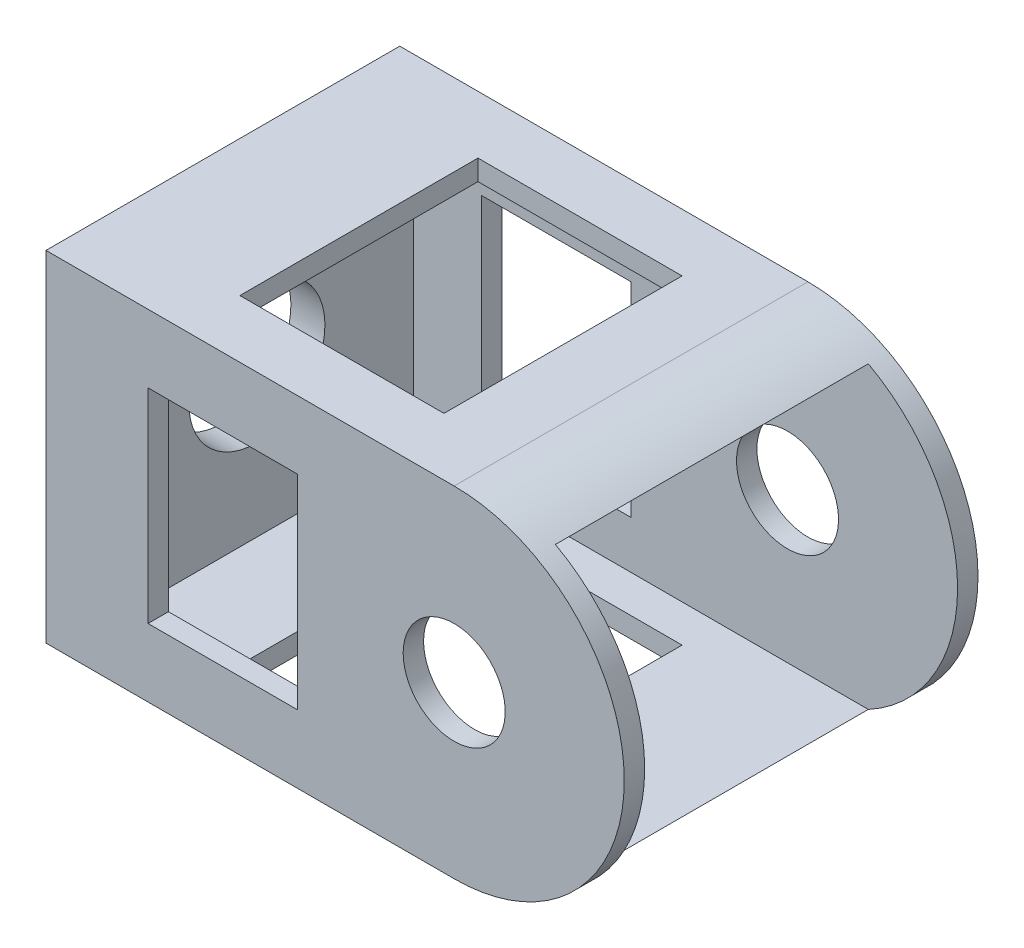
ISO-10303-21;
HEADER;
FILE_DESCRIPTION(('STEP AP214'),'2;1');
FILE_NAME('part.step','',(''),(''),'','','');
FILE_SCHEMA(('AUTOMOTIVE_DESIGN { 1 0 10303 214 1 1 1 1 }'));
ENDSEC;
DATA;
#1=APPLICATION_CONTEXT('core data for automotive mechanical design processes');
#2=APPLICATION_PROTOCOL_DEFINITION('international standard','automotive_design',2000,#1);
#3=PRODUCT_CONTEXT('',#1,'mechanical');
#4=PRODUCT('Part','Part','',(#3));
#5=PRODUCT_RELATED_PRODUCT_CATEGORY('part','',(#4));
#6=PRODUCT_DEFINITION_FORMATION('','',#4);
#7=PRODUCT_DEFINITION_CONTEXT('part definition',#1,'design');
#8=PRODUCT_DEFINITION('design','',#6,#7);
#9=PRODUCT_DEFINITION_SHAPE('','',#8);
#10=(LENGTH_UNIT() NAMED_UNIT(*) SI_UNIT(.MILLI.,.METRE.));
#11=(NAMED_UNIT(*) PLANE_ANGLE_UNIT() SI_UNIT($,.RADIAN.));
#12=(NAMED_UNIT(*) SI_UNIT($,.STERADIAN.) SOLID_ANGLE_UNIT());
#13=UNCERTAINTY_MEASURE_WITH_UNIT(LENGTH_MEASURE(1.E-05),#10,'distance_accuracy_value','');
#14=(GEOMETRIC_REPRESENTATION_CONTEXT(3) GLOBAL_UNCERTAINTY_ASSIGNED_CONTEXT((#13)) GLOBAL_UNIT_ASSIGNED_CONTEXT((#10,
#11,#12)) REPRESENTATION_CONTEXT('',''));
#15=CARTESIAN_POINT('',(0.,0.,0.));
#16=DIRECTION('',(0.,0.,1.));
#17=DIRECTION('',(1.,0.,0.));
#18=AXIS2_PLACEMENT_3D('',#15,#16,#17);
#19=CARTESIAN_POINT('',(55.,-25.,52.));
#20=DIRECTION('',(0.,0.,-1.));
#21=DIRECTION('',(-1.,0.,0.));
#22=AXIS2_PLACEMENT_3D('',#19,#20,#21);
#23=CYLINDRICAL_SURFACE('',#22,7.5);
#24=CARTESIAN_POINT('',(55.,-25.,49.));
#25=DIRECTION('',(0.,0.,1.));
#26=DIRECTION('',(1.,0.,0.));
#27=AXIS2_PLACEMENT_3D('',#24,#25,#26);
#28=CIRCLE('',#27,7.5);
#29=CARTESIAN_POINT('',(47.5,-25.,49.));
#30=VERTEX_POINT('',#29);
#31=EDGE_CURVE('E293',#30,#30,#28,.T.);
#32=CARTESIAN_POINT('',(55.,-25.,52.));
#33=DIRECTION('',(0.,0.,1.));
#34=DIRECTION('',(1.,0.,0.));
#35=AXIS2_PLACEMENT_3D('',#32,#33,#34);
#36=CIRCLE('',#35,7.5);
#37=CARTESIAN_POINT('',(47.5,-25.,52.));
#38=VERTEX_POINT('',#37);
#39=EDGE_CURVE('E209',#38,#38,#36,.T.);
#40=CARTESIAN_POINT('',(47.5,-25.,49.));
#41=CARTESIAN_POINT('',(47.5,-25.,49.03125));
#42=CARTESIAN_POINT('',(47.5,-25.,49.0625));
#43=CARTESIAN_POINT('',(47.5,-25.,49.125));
#44=CARTESIAN_POINT('',(47.5,-25.,49.15625));
#45=CARTESIAN_POINT('',(47.5,-25.,49.21875));
#46=CARTESIAN_POINT('',(47.5,-25.,49.25));
#47=CARTESIAN_POINT('',(47.5,-25.,49.3125));
#48=CARTESIAN_POINT('',(47.5,-25.,49.34375));
#49=CARTESIAN_POINT('',(47.5,-25.,49.40625));
#50=CARTESIAN_POINT('',(47.5,-25.,49.4375));
#51=CARTESIAN_POINT('',(47.5,-25.,49.5));
#52=CARTESIAN_POINT('',(47.5,-25.,49.53125));
#53=CARTESIAN_POINT('',(47.5,-25.,49.59375));
#54=CARTESIAN_POINT('',(47.5,-25.,49.625));
#55=CARTESIAN_POINT('',(47.5,-25.,49.6875));
#56=CARTESIAN_POINT('',(47.5,-25.,49.71875));
#57=CARTESIAN_POINT('',(47.5,-25.,49.78125));
#58=CARTESIAN_POINT('',(47.5,-25.,49.8125));
#59=CARTESIAN_POINT('',(47.5,-25.,49.875));
#60=CARTESIAN_POINT('',(47.5,-25.,49.90625));
#61=CARTESIAN_POINT('',(47.5,-25.,49.96875));
#62=CARTESIAN_POINT('',(47.5,-25.,50.));
#63=CARTESIAN_POINT('',(47.5,-25.,50.0625));
#64=CARTESIAN_POINT('',(47.5,-25.,50.09375));
#65=CARTESIAN_POINT('',(47.5,-25.,50.15625));
#66=CARTESIAN_POINT('',(47.5,-25.,50.1875));
#67=CARTESIAN_POINT('',(47.5,-25.,50.25));
#68=CARTESIAN_POINT('',(47.5,-25.,50.28125));
#69=CARTESIAN_POINT('',(47.5,-25.,50.34375));
#70=CARTESIAN_POINT('',(47.5,-25.,50.375));
#71=CARTESIAN_POINT('',(47.5,-25.,50.4375));
#72=CARTESIAN_POINT('',(47.5,-25.,50.46875));
#73=CARTESIAN_POINT('',(47.5,-25.,50.53125));
#74=CARTESIAN_POINT('',(47.5,-25.,50.5625));
#75=CARTESIAN_POINT('',(47.5,-25.,50.625));
#76=CARTESIAN_POINT('',(47.5,-25.,50.65625));
#77=CARTESIAN_POINT('',(47.5,-25.,50.71875));
#78=CARTESIAN_POINT('',(47.5,-25.,50.75));
#79=CARTESIAN_POINT('',(47.5,-25.,50.8125));
#80=CARTESIAN_POINT('',(47.5,-25.,50.84375));
#81=CARTESIAN_POINT('',(47.5,-25.,50.90625));
#82=CARTESIAN_POINT('',(47.5,-25.,50.9375));
#83=CARTESIAN_POINT('',(47.5,-25.,51.));
#84=CARTESIAN_POINT('',(47.5,-25.,51.03125));
#85=CARTESIAN_POINT('',(47.5,-25.,51.09375));
#86=CARTESIAN_POINT('',(47.5,-25.,51.125));
#87=CARTESIAN_POINT('',(47.5,-25.,51.1875));
#88=CARTESIAN_POINT('',(47.5,-25.,51.21875));
#89=CARTESIAN_POINT('',(47.5,-25.,51.28125));
#90=CARTESIAN_POINT('',(47.5,-25.,51.3125));
#91=CARTESIAN_POINT('',(47.5,-25.,51.375));
#92=CARTESIAN_POINT('',(47.5,-25.,51.40625));
#93=CARTESIAN_POINT('',(47.5,-25.,51.46875));
#94=CARTESIAN_POINT('',(47.5,-25.,51.5));
#95=CARTESIAN_POINT('',(47.5,-25.,51.5625));
#96=CARTESIAN_POINT('',(47.5,-25.,51.59375));
#97=CARTESIAN_POINT('',(47.5,-25.,51.65625));
#98=CARTESIAN_POINT('',(47.5,-25.,51.6875));
#99=CARTESIAN_POINT('',(47.5,-25.,51.75));
#100=CARTESIAN_POINT('',(47.5,-25.,51.78125));
#101=CARTESIAN_POINT('',(47.5,-25.,51.84375));
#102=CARTESIAN_POINT('',(47.5,-25.,51.875));
#103=CARTESIAN_POINT('',(47.5,-25.,51.9375));
#104=CARTESIAN_POINT('',(47.5,-25.,51.96875));
#105=CARTESIAN_POINT('',(47.5,-25.,52.));
#106=B_SPLINE_CURVE_WITH_KNOTS('',3,(#40,#41,#42,#43,#44,#45,#46,#47,#48,#49,#50,#51,#52,#53,
#54,#55,#56,#57,#58,#59,#60,#61,#62,#63,#64,#65,#66,#67,#68,#69,#70,#71,#72,#73,#74,#75,#76,#77,
#78,#79,#80,#81,#82,#83,#84,#85,#86,#87,#88,#89,#90,#91,#92,#93,#94,#95,#96,#97,#98,#99,#100,
#101,#102,#103,#104,#105),.UNSPECIFIED.,.F.,.F.,(4,2,2,2,2,2,2,2,2,2,2,2,2,2,2,2,2,2,2,2,2,2,2,
2,2,2,2,2,2,2,2,2,4),(0.,0.0937499999999966,0.1875,0.281249999999997,0.375,0.468749999999997,
0.5625,0.656249999999997,0.750000000000001,0.843749999999997,0.937500000000001,1.03125,1.125,
1.21875,1.3125,1.40625,1.5,1.59375,1.6875,1.78125,1.875,1.96875,2.0625,2.15625,2.25,2.34375,
2.4375,2.53125,2.625,2.71875,2.8125,2.90625,3.),.UNSPECIFIED.);
#107=EDGE_CURVE('BSEAM37',#30,#38,#106,.T.);
#108=ORIENTED_EDGE('',*,*,#31,.F.);
#109=ORIENTED_EDGE('',*,*,#39,.T.);
#110=ORIENTED_EDGE('',*,*,#107,.T.);
#111=ORIENTED_EDGE('',*,*,#107,.F.);
#112=EDGE_LOOP('',(#108,#110,#109,#111));
#113=FACE_BOUND('',#112,.T.);
#114=ADVANCED_FACE('F37',(#113),#23,.F.);
#115=CARTESIAN_POINT('',(10.,-10.,52.));
#116=DIRECTION('',(1.,0.,0.));
#117=DIRECTION('',(0.,0.,-1.));
#118=AXIS2_PLACEMENT_3D('',#115,#116,#117);
#119=PLANE('',#118);
#120=DIRECTION('',(0.,-1.,0.));
#121=VECTOR('',#120,1.);
#122=CARTESIAN_POINT('',(10.,-10.,49.));
#123=LINE('',#122,#121);
#124=CARTESIAN_POINT('',(10.,-10.,49.));
#125=VERTEX_POINT('',#124);
#126=CARTESIAN_POINT('',(10.,-40.,49.));
#127=VERTEX_POINT('',#126);
#128=EDGE_CURVE('E291',#125,#127,#123,.T.);
#129=ORIENTED_EDGE('',*,*,#128,.F.);
#130=DIRECTION('',(0.,0.,-1.));
#131=VECTOR('',#130,1.);
#132=CARTESIAN_POINT('',(10.,-10.,52.));
#133=LINE('',#132,#131);
#134=CARTESIAN_POINT('',(10.,-10.,52.));
#135=VERTEX_POINT('',#134);
#136=EDGE_CURVE('E360',#135,#125,#133,.T.);
#137=ORIENTED_EDGE('',*,*,#136,.F.);
#138=DIRECTION('',(0.,-1.,0.));
#139=VECTOR('',#138,1.);
#140=CARTESIAN_POINT('',(10.,-10.,52.));
#141=LINE('',#140,#139);
#142=CARTESIAN_POINT('',(10.,-40.,52.));
#143=VERTEX_POINT('',#142);
#144=EDGE_CURVE('E339',#135,#143,#141,.T.);
#145=ORIENTED_EDGE('',*,*,#144,.T.);
#146=DIRECTION('',(0.,0.,-1.));
#147=VECTOR('',#146,1.);
#148=CARTESIAN_POINT('',(10.,-40.,52.));
#149=LINE('',#148,#147);
#150=EDGE_CURVE('E372',#143,#127,#149,.T.);
#151=ORIENTED_EDGE('',*,*,#150,.T.);
#152=EDGE_LOOP('',(#129,#137,#145,#151));
#153=FACE_BOUND('',#152,.T.);
#154=ADVANCED_FACE('F421',(#153),#119,.T.);
#155=CARTESIAN_POINT('',(10.,-40.,52.));
#156=DIRECTION('',(0.,1.,0.));
#157=DIRECTION('',(0.,0.,1.));
#158=AXIS2_PLACEMENT_3D('',#155,#156,#157);
#159=PLANE('',#158);
#160=DIRECTION('',(1.,0.,0.));
#161=VECTOR('',#160,1.);
#162=CARTESIAN_POINT('',(10.,-40.,49.));
#163=LINE('',#162,#161);
#164=CARTESIAN_POINT('',(32.,-40.,49.));
#165=VERTEX_POINT('',#164);
#166=EDGE_CURVE('E289',#127,#165,#163,.T.);
#167=ORIENTED_EDGE('',*,*,#166,.F.);
#168=ORIENTED_EDGE('',*,*,#150,.F.);
#169=DIRECTION('',(1.,0.,0.));
#170=VECTOR('',#169,1.);
#171=CARTESIAN_POINT('',(10.,-40.,52.));
#172=LINE('',#171,#170);
#173=CARTESIAN_POINT('',(32.,-40.,52.));
#174=VERTEX_POINT('',#173);
#175=EDGE_CURVE('E341',#143,#174,#172,.T.);
#176=ORIENTED_EDGE('',*,*,#175,.T.);
#177=DIRECTION('',(0.,0.,-1.));
#178=VECTOR('',#177,1.);
#179=CARTESIAN_POINT('',(32.,-40.,52.));
#180=LINE('',#179,#178);
#181=EDGE_CURVE('E368',#174,#165,#180,.T.);
#182=ORIENTED_EDGE('',*,*,#181,.T.);
#183=EDGE_LOOP('',(#167,#168,#176,#182));
#184=FACE_BOUND('',#183,.T.);
#185=ADVANCED_FACE('F428',(#184),#159,.T.);
#186=CARTESIAN_POINT('',(10.,-10.,52.));
#187=DIRECTION('',(0.,-1.,0.));
#188=DIRECTION('',(0.,0.,-1.));
#189=AXIS2_PLACEMENT_3D('',#186,#187,#188);
#190=PLANE('',#189);
#191=DIRECTION('',(-1.,0.,0.));
#192=VECTOR('',#191,1.);
#193=CARTESIAN_POINT('',(10.,-10.,49.));
#194=LINE('',#193,#192);
#195=CARTESIAN_POINT('',(32.,-10.,49.));
#196=VERTEX_POINT('',#195);
#197=EDGE_CURVE('E11',#196,#125,#194,.T.);
#198=ORIENTED_EDGE('',*,*,#197,.F.);
#199=DIRECTION('',(0.,0.,-1.));
#200=VECTOR('',#199,1.);
#201=CARTESIAN_POINT('',(32.,-10.,52.));
#202=LINE('',#201,#200);
#203=CARTESIAN_POINT('',(32.,-10.,52.));
#204=VERTEX_POINT('',#203);
#205=EDGE_CURVE('E364',#204,#196,#202,.T.);
#206=ORIENTED_EDGE('',*,*,#205,.F.);
#207=DIRECTION('',(-1.,0.,0.));
#208=VECTOR('',#207,1.);
#209=CARTESIAN_POINT('',(10.,-10.,52.));
#210=LINE('',#209,#208);
#211=EDGE_CURVE('E347',#204,#135,#210,.T.);
#212=ORIENTED_EDGE('',*,*,#211,.T.);
#213=ORIENTED_EDGE('',*,*,#136,.T.);
#214=EDGE_LOOP('',(#198,#206,#212,#213));
#215=FACE_BOUND('',#214,.T.);
#216=ADVANCED_FACE('F481',(#215),#190,.T.);
#217=CARTESIAN_POINT('',(15.,-50.,8.5));
#218=DIRECTION('',(0.,0.,-1.));
#219=DIRECTION('',(-1.,0.,0.));
#220=AXIS2_PLACEMENT_3D('',#217,#218,#219);
#221=PLANE('',#220);
#222=DIRECTION('',(0.,1.,0.));
#223=VECTOR('',#222,1.);
#224=CARTESIAN_POINT('',(15.,-50.,8.5));
#225=LINE('',#224,#223);
#226=CARTESIAN_POINT('',(15.,-3.,8.5));
#227=VERTEX_POINT('',#226);
#228=CARTESIAN_POINT('',(15.,0.,8.5));
#229=VERTEX_POINT('',#228);
#230=EDGE_CURVE('E327',#227,#229,#225,.T.);
#231=ORIENTED_EDGE('',*,*,#230,.F.);
#232=DIRECTION('',(1.,0.,0.));
#233=VECTOR('',#232,1.);
#234=CARTESIAN_POINT('',(15.,-3.,8.5));
#235=LINE('',#234,#233);
#236=CARTESIAN_POINT('',(45.,-3.,8.5));
#237=VERTEX_POINT('',#236);
#238=EDGE_CURVE('E270',#227,#237,#235,.T.);
#239=ORIENTED_EDGE('',*,*,#238,.T.);
#240=DIRECTION('',(0.,1.,0.));
#241=VECTOR('',#240,1.);
#242=CARTESIAN_POINT('',(45.,-50.,8.5));
#243=LINE('',#242,#241);
#244=CARTESIAN_POINT('',(45.,0.,8.5));
#245=VERTEX_POINT('',#244);
#246=EDGE_CURVE('E331',#237,#245,#243,.T.);
#247=ORIENTED_EDGE('',*,*,#246,.T.);
#248=DIRECTION('',(-1.,0.,0.));
#249=VECTOR('',#248,1.);
#250=CARTESIAN_POINT('',(15.,0.,8.5));
#251=LINE('',#250,#249);
#252=EDGE_CURVE('E303',#245,#229,#251,.T.);
#253=ORIENTED_EDGE('',*,*,#252,.T.);
#254=EDGE_LOOP('',(#231,#239,#247,#253));
#255=FACE_BOUND('',#254,.T.);
#256=ADVANCED_FACE('F484',(#255),#221,.F.);
#257=CARTESIAN_POINT('',(45.,-50.,8.5));
#258=DIRECTION('',(1.,0.,0.));
#259=DIRECTION('',(0.,0.,-1.));
#260=AXIS2_PLACEMENT_3D('',#257,#258,#259);
#261=PLANE('',#260);
#262=ORIENTED_EDGE('',*,*,#246,.F.);
#263=DIRECTION('',(0.,0.,1.));
#264=VECTOR('',#263,1.);
#265=CARTESIAN_POINT('',(45.,-3.,8.5));
#266=LINE('',#265,#264);
#267=CARTESIAN_POINT('',(45.,-2.99999999999999,43.5));
#268=VERTEX_POINT('',#267);
#269=EDGE_CURVE('E267',#237,#268,#266,.T.);
#270=ORIENTED_EDGE('',*,*,#269,.T.);
#271=DIRECTION('',(0.,1.,0.));
#272=VECTOR('',#271,1.);
#273=CARTESIAN_POINT('',(45.,-50.,43.5));
#274=LINE('',#273,#272);
#275=CARTESIAN_POINT('',(45.,0.,43.5));
#276=VERTEX_POINT('',#275);
#277=EDGE_CURVE('E335',#268,#276,#274,.T.);
#278=ORIENTED_EDGE('',*,*,#277,.T.);
#279=DIRECTION('',(0.,0.,-1.));
#280=VECTOR('',#279,1.);
#281=CARTESIAN_POINT('',(45.,0.,8.5));
#282=LINE('',#281,#280);
#283=EDGE_CURVE('E318',#276,#245,#282,.T.);
#284=ORIENTED_EDGE('',*,*,#283,.T.);
#285=EDGE_LOOP('',(#262,#270,#278,#284));
#286=FACE_BOUND('',#285,.T.);
#287=ADVANCED_FACE('F490',(#286),#261,.F.);
#288=CARTESIAN_POINT('',(15.,-50.,43.5));
#289=DIRECTION('',(0.,0.,1.));
#290=DIRECTION('',(1.,0.,0.));
#291=AXIS2_PLACEMENT_3D('',#288,#289,#290);
#292=PLANE('',#291);
#293=ORIENTED_EDGE('',*,*,#277,.F.);
#294=DIRECTION('',(-1.,0.,0.));
#295=VECTOR('',#294,1.);
#296=CARTESIAN_POINT('',(15.,-3.,43.5));
#297=LINE('',#296,#295);
#298=CARTESIAN_POINT('',(15.,-3.,43.5));
#299=VERTEX_POINT('',#298);
#300=EDGE_CURVE('E396',#268,#299,#297,.T.);
#301=ORIENTED_EDGE('',*,*,#300,.T.);
#302=DIRECTION('',(0.,1.,0.));
#303=VECTOR('',#302,1.);
#304=CARTESIAN_POINT('',(15.,-50.,43.5));
#305=LINE('',#304,#303);
#306=CARTESIAN_POINT('',(15.,0.,43.5));
#307=VERTEX_POINT('',#306);
#308=EDGE_CURVE('E312',#299,#307,#305,.T.);
#309=ORIENTED_EDGE('',*,*,#308,.T.);
#310=DIRECTION('',(1.,0.,0.));
#311=VECTOR('',#310,1.);
#312=CARTESIAN_POINT('',(15.,0.,43.5));
#313=LINE('',#312,#311);
#314=EDGE_CURVE('E315',#307,#276,#313,.T.);
#315=ORIENTED_EDGE('',*,*,#314,.T.);
#316=EDGE_LOOP('',(#293,#301,#309,#315));
#317=FACE_BOUND('',#316,.T.);
#318=ADVANCED_FACE('F507',(#317),#292,.F.);
#319=CARTESIAN_POINT('',(32.,-10.,52.));
#320=DIRECTION('',(-1.,0.,0.));
#321=DIRECTION('',(0.,0.,1.));
#322=AXIS2_PLACEMENT_3D('',#319,#320,#321);
#323=PLANE('',#322);
#324=DIRECTION('',(0.,-1.,0.));
#325=VECTOR('',#324,1.);
#326=CARTESIAN_POINT('',(32.,-10.,3.));
#327=LINE('',#326,#325);
#328=CARTESIAN_POINT('',(32.,-10.,3.));
#329=VERTEX_POINT('',#328);
#330=CARTESIAN_POINT('',(32.,-40.,3.));
#331=VERTEX_POINT('',#330);
#332=EDGE_CURVE('E279',#329,#331,#327,.T.);
#333=ORIENTED_EDGE('',*,*,#332,.F.);
#334=CARTESIAN_POINT('',(32.,-10.,0.));
#335=VERTEX_POINT('',#334);
#336=EDGE_CURVE('E363',#329,#335,#202,.T.);
#337=ORIENTED_EDGE('',*,*,#336,.T.);
#338=DIRECTION('',(0.,1.,0.));
#339=VECTOR('',#338,1.);
#340=CARTESIAN_POINT('',(32.,-10.,0.));
#341=LINE('',#340,#339);
#342=CARTESIAN_POINT('',(32.,-40.,0.));
#343=VERTEX_POINT('',#342);
#344=EDGE_CURVE('E355',#343,#335,#341,.T.);
#345=ORIENTED_EDGE('',*,*,#344,.F.);
#346=EDGE_CURVE('E367',#331,#343,#180,.T.);
#347=ORIENTED_EDGE('',*,*,#346,.F.);
#348=EDGE_LOOP('',(#333,#337,#345,#347));
#349=FACE_BOUND('',#348,.T.);
#350=ADVANCED_FACE('F407',(#349),#323,.T.);
#351=CARTESIAN_POINT('',(55.,-25.,52.));
#352=DIRECTION('',(0.,0.,1.));
#353=DIRECTION('',(1.,0.,0.));
#354=AXIS2_PLACEMENT_3D('',#351,#352,#353);
#355=PLANE('',#354);
#356=DIRECTION('',(-1.,0.,0.));
#357=VECTOR('',#356,1.);
#358=CARTESIAN_POINT('',(0.,0.,52.));
#359=LINE('',#358,#357);
#360=CARTESIAN_POINT('',(55.,0.,52.));
#361=VERTEX_POINT('',#360);
#362=CARTESIAN_POINT('',(-5.,0.,52.));
#363=VERTEX_POINT('',#362);
#364=EDGE_CURVE('E384',#361,#363,#359,.T.);
#365=ORIENTED_EDGE('',*,*,#364,.T.);
#366=DIRECTION('',(0.,1.,0.));
#367=VECTOR('',#366,1.);
#368=CARTESIAN_POINT('',(-5.,0.,52.));
#369=LINE('',#368,#367);
#370=CARTESIAN_POINT('',(-4.99999999999999,-50.,52.));
#371=VERTEX_POINT('',#370);
#372=EDGE_CURVE('E217',#371,#363,#369,.T.);
#373=ORIENTED_EDGE('',*,*,#372,.F.);
#374=DIRECTION('',(1.,0.,0.));
#375=VECTOR('',#374,1.);
#376=CARTESIAN_POINT('',(0.,-50.,52.));
#377=LINE('',#376,#375);
#378=CARTESIAN_POINT('',(55.,-50.,52.));
#379=VERTEX_POINT('',#378);
#380=EDGE_CURVE('E213',#371,#379,#377,.T.);
#381=ORIENTED_EDGE('',*,*,#380,.T.);
#382=CARTESIAN_POINT('',(55.,-25.,52.));
#383=DIRECTION('',(0.,0.,1.));
#384=DIRECTION('',(1.,0.,0.));
#385=AXIS2_PLACEMENT_3D('',#382,#383,#384);
#386=CIRCLE('',#385,25.);
#387=EDGE_CURVE('E381',#379,#361,#386,.T.);
#388=ORIENTED_EDGE('',*,*,#387,.T.);
#389=EDGE_LOOP('',(#365,#373,#381,#388));
#390=FACE_BOUND('',#389,.T.);
#391=ORIENTED_EDGE('',*,*,#39,.F.);
#392=EDGE_LOOP('',(#391));
#393=FACE_BOUND('',#392,.T.);
#394=ORIENTED_EDGE('',*,*,#175,.F.);
#395=ORIENTED_EDGE('',*,*,#144,.F.);
#396=ORIENTED_EDGE('',*,*,#211,.F.);
#397=DIRECTION('',(0.,1.,0.));
#398=VECTOR('',#397,1.);
#399=CARTESIAN_POINT('',(32.,-10.,52.));
#400=LINE('',#399,#398);
#401=EDGE_CURVE('E344',#174,#204,#400,.T.);
#402=ORIENTED_EDGE('',*,*,#401,.F.);
#403=EDGE_LOOP('',(#394,#395,#396,#402));
#404=FACE_BOUND('',#403,.T.);
#405=ADVANCED_FACE('F441',(#390,#393,#404),#355,.T.);
#406=CARTESIAN_POINT('',(55.,-25.,0.));
#407=DIRECTION('',(0.,0.,1.));
#408=DIRECTION('',(1.,0.,0.));
#409=AXIS2_PLACEMENT_3D('',#406,#407,#408);
#410=PLANE('',#409);
#411=CARTESIAN_POINT('',(55.,-25.,0.));
#412=DIRECTION('',(0.,0.,1.));
#413=DIRECTION('',(1.,0.,0.));
#414=AXIS2_PLACEMENT_3D('',#411,#412,#413);
#415=CIRCLE('',#414,7.5);
#416=CARTESIAN_POINT('',(47.5,-25.,0.));
#417=VERTEX_POINT('',#416);
#418=EDGE_CURVE('E375',#417,#417,#415,.T.);
#419=ORIENTED_EDGE('',*,*,#418,.T.);
#420=EDGE_LOOP('',(#419));
#421=FACE_BOUND('',#420,.T.);
#422=DIRECTION('',(1.,0.,0.));
#423=VECTOR('',#422,1.);
#424=CARTESIAN_POINT('',(0.,-50.,0.));
#425=LINE('',#424,#423);
#426=CARTESIAN_POINT('',(-4.99999999999999,-50.,0.));
#427=VERTEX_POINT('',#426);
#428=CARTESIAN_POINT('',(55.,-50.,0.));
#429=VERTEX_POINT('',#428);
#430=EDGE_CURVE('E198',#427,#429,#425,.T.);
#431=ORIENTED_EDGE('',*,*,#430,.F.);
#432=DIRECTION('',(0.,-1.,0.));
#433=VECTOR('',#432,1.);
#434=CARTESIAN_POINT('',(-5.,0.,0.));
#435=LINE('',#434,#433);
#436=CARTESIAN_POINT('',(-5.,0.,0.));
#437=VERTEX_POINT('',#436);
#438=EDGE_CURVE('E204',#437,#427,#435,.T.);
#439=ORIENTED_EDGE('',*,*,#438,.F.);
#440=DIRECTION('',(-1.,0.,0.));
#441=VECTOR('',#440,1.);
#442=CARTESIAN_POINT('',(0.,0.,0.));
#443=LINE('',#442,#441);
#444=CARTESIAN_POINT('',(55.,0.,0.));
#445=VERTEX_POINT('',#444);
#446=EDGE_CURVE('E382',#445,#437,#443,.T.);
#447=ORIENTED_EDGE('',*,*,#446,.F.);
#448=CARTESIAN_POINT('',(55.,-25.,0.));
#449=DIRECTION('',(0.,0.,1.));
#450=DIRECTION('',(1.,0.,0.));
#451=AXIS2_PLACEMENT_3D('',#448,#449,#450);
#452=CIRCLE('',#451,25.);
#453=EDGE_CURVE('E205',#429,#445,#452,.T.);
#454=ORIENTED_EDGE('',*,*,#453,.F.);
#455=EDGE_LOOP('',(#431,#439,#447,#454));
#456=FACE_BOUND('',#455,.T.);
#457=DIRECTION('',(0.,-1.,0.));
#458=VECTOR('',#457,1.);
#459=CARTESIAN_POINT('',(10.,-10.,0.));
#460=LINE('',#459,#458);
#461=CARTESIAN_POINT('',(10.,-10.,0.));
#462=VERTEX_POINT('',#461);
#463=CARTESIAN_POINT('',(10.,-40.,0.));
#464=VERTEX_POINT('',#463);
#465=EDGE_CURVE('E326',#462,#464,#460,.T.);
#466=ORIENTED_EDGE('',*,*,#465,.T.);
#467=DIRECTION('',(1.,0.,0.));
#468=VECTOR('',#467,1.);
#469=CARTESIAN_POINT('',(10.,-40.,0.));
#470=LINE('',#469,#468);
#471=EDGE_CURVE('E352',#464,#343,#470,.T.);
#472=ORIENTED_EDGE('',*,*,#471,.T.);
#473=ORIENTED_EDGE('',*,*,#344,.T.);
#474=DIRECTION('',(-1.,0.,0.));
#475=VECTOR('',#474,1.);
#476=CARTESIAN_POINT('',(10.,-10.,0.));
#477=LINE('',#476,#475);
#478=EDGE_CURVE('E342',#335,#462,#477,.T.);
#479=ORIENTED_EDGE('',*,*,#478,.T.);
#480=EDGE_LOOP('',(#466,#472,#473,#479));
#481=FACE_BOUND('',#480,.T.);
#482=ADVANCED_FACE('F200',(#421,#456,#481),#410,.F.);
#483=CARTESIAN_POINT('',(0.,-50.,52.));
#484=DIRECTION('',(0.,1.,0.));
#485=DIRECTION('',(0.,0.,1.));
#486=AXIS2_PLACEMENT_3D('',#483,#484,#485);
#487=PLANE('',#486);
#488=DIRECTION('',(-1.,0.,0.));
#489=VECTOR('',#488,1.);
#490=CARTESIAN_POINT('',(15.,-50.,8.5));
#491=LINE('',#490,#489);
#492=CARTESIAN_POINT('',(45.,-50.,8.5));
#493=VERTEX_POINT('',#492);
#494=CARTESIAN_POINT('',(15.,-50.,8.5));
#495=VERTEX_POINT('',#494);
#496=EDGE_CURVE('E309',#493,#495,#491,.T.);
#497=ORIENTED_EDGE('',*,*,#496,.T.);
#498=DIRECTION('',(0.,0.,1.));
#499=VECTOR('',#498,1.);
#500=CARTESIAN_POINT('',(15.,-50.,8.5));
#501=LINE('',#500,#499);
#502=CARTESIAN_POINT('',(15.,-50.,43.5));
#503=VERTEX_POINT('',#502);
#504=EDGE_CURVE('E299',#495,#503,#501,.T.);
#505=ORIENTED_EDGE('',*,*,#504,.T.);
#506=DIRECTION('',(1.,0.,0.));
#507=VECTOR('',#506,1.);
#508=CARTESIAN_POINT('',(15.,-50.,43.5));
#509=LINE('',#508,#507);
#510=CARTESIAN_POINT('',(45.,-50.,43.5));
#511=VERTEX_POINT('',#510);
#512=EDGE_CURVE('E302',#503,#511,#509,.T.);
#513=ORIENTED_EDGE('',*,*,#512,.T.);
#514=DIRECTION('',(0.,0.,-1.));
#515=VECTOR('',#514,1.);
#516=CARTESIAN_POINT('',(45.,-50.,8.5));
#517=LINE('',#516,#515);
#518=EDGE_CURVE('E306',#511,#493,#517,.T.);
#519=ORIENTED_EDGE('',*,*,#518,.T.);
#520=EDGE_LOOP('',(#497,#505,#513,#519));
#521=FACE_BOUND('',#520,.T.);
#522=ORIENTED_EDGE('',*,*,#430,.T.);
#523=DIRECTION('',(0.,0.,-1.));
#524=VECTOR('',#523,1.);
#525=CARTESIAN_POINT('',(55.,-50.,52.));
#526=LINE('',#525,#524);
#527=EDGE_CURVE('E391',#379,#429,#526,.T.);
#528=ORIENTED_EDGE('',*,*,#527,.F.);
#529=ORIENTED_EDGE('',*,*,#380,.F.);
#530=DIRECTION('',(0.,0.,1.));
#531=VECTOR('',#530,1.);
#532=CARTESIAN_POINT('',(-4.99999999999999,-50.,0.));
#533=LINE('',#532,#531);
#534=EDGE_CURVE('E212',#427,#371,#533,.T.);
#535=ORIENTED_EDGE('',*,*,#534,.F.);
#536=EDGE_LOOP('',(#522,#528,#529,#535));
#537=FACE_BOUND('',#536,.T.);
#538=ADVANCED_FACE('F39',(#521,#537),#487,.F.);
#539=CARTESIAN_POINT('',(55.,-25.,52.));
#540=DIRECTION('',(0.,0.,-1.));
#541=DIRECTION('',(-1.,0.,0.));
#542=AXIS2_PLACEMENT_3D('',#539,#540,#541);
#543=CYLINDRICAL_SURFACE('',#542,25.);
#544=DIRECTION('',(0.,0.,-1.));
#545=VECTOR('',#544,1.);
#546=CARTESIAN_POINT('',(66.8743420870379,-2.99999999999999,52.));
#547=LINE('',#546,#545);
#548=CARTESIAN_POINT('',(66.8743420870379,-2.99999999999999,49.));
#549=VERTEX_POINT('',#548);
#550=CARTESIAN_POINT('',(66.8743420870379,-2.99999999999999,3.));
#551=VERTEX_POINT('',#550);
#552=EDGE_CURVE('E276',#549,#551,#547,.T.);
#553=ORIENTED_EDGE('',*,*,#552,.T.);
#554=CARTESIAN_POINT('',(55.,-25.,3.));
#555=DIRECTION('',(0.,0.,-1.));
#556=DIRECTION('',(-1.,0.,0.));
#557=AXIS2_PLACEMENT_3D('',#554,#555,#556);
#558=CIRCLE('',#557,25.);
#559=CARTESIAN_POINT('',(66.8743420870379,-47.,3.));
#560=VERTEX_POINT('',#559);
#561=EDGE_CURVE('E52',#551,#560,#558,.T.);
#562=ORIENTED_EDGE('',*,*,#561,.T.);
#563=DIRECTION('',(0.,0.,-1.));
#564=VECTOR('',#563,1.);
#565=CARTESIAN_POINT('',(66.8743420870379,-47.,52.));
#566=LINE('',#565,#564);
#567=CARTESIAN_POINT('',(66.8743420870379,-47.,49.));
#568=VERTEX_POINT('',#567);
#569=EDGE_CURVE('E265',#560,#568,#566,.F.);
#570=ORIENTED_EDGE('',*,*,#569,.T.);
#571=CARTESIAN_POINT('',(55.,-25.,49.));
#572=DIRECTION('',(0.,0.,1.));
#573=DIRECTION('',(1.,0.,0.));
#574=AXIS2_PLACEMENT_3D('',#571,#572,#573);
#575=CIRCLE('',#574,25.);
#576=EDGE_CURVE('E296',#568,#549,#575,.T.);
#577=ORIENTED_EDGE('',*,*,#576,.T.);
#578=EDGE_LOOP('',(#553,#562,#570,#577));
#579=FACE_BOUND('',#578,.T.);
#580=ORIENTED_EDGE('',*,*,#453,.T.);
#581=DIRECTION('',(0.,0.,-1.));
#582=VECTOR('',#581,1.);
#583=CARTESIAN_POINT('',(55.,0.,52.));
#584=LINE('',#583,#582);
#585=EDGE_CURVE('E385',#361,#445,#584,.T.);
#586=ORIENTED_EDGE('',*,*,#585,.F.);
#587=ORIENTED_EDGE('',*,*,#387,.F.);
#588=ORIENTED_EDGE('',*,*,#527,.T.);
#589=EDGE_LOOP('',(#580,#586,#587,#588));
#590=FACE_BOUND('',#589,.T.);
#591=ADVANCED_FACE('F449',(#579,#590),#543,.T.);
#592=CARTESIAN_POINT('',(0.,0.,52.));
#593=DIRECTION('',(0.,-1.,0.));
#594=DIRECTION('',(0.,0.,-1.));
#595=AXIS2_PLACEMENT_3D('',#592,#593,#594);
#596=PLANE('',#595);
#597=ORIENTED_EDGE('',*,*,#314,.F.);
#598=DIRECTION('',(0.,0.,1.));
#599=VECTOR('',#598,1.);
#600=CARTESIAN_POINT('',(15.,0.,8.5));
#601=LINE('',#600,#599);
#602=EDGE_CURVE('E298',#229,#307,#601,.T.);
#603=ORIENTED_EDGE('',*,*,#602,.F.);
#604=ORIENTED_EDGE('',*,*,#252,.F.);
#605=ORIENTED_EDGE('',*,*,#283,.F.);
#606=EDGE_LOOP('',(#597,#603,#604,#605));
#607=FACE_BOUND('',#606,.T.);
#608=ORIENTED_EDGE('',*,*,#446,.T.);
#609=DIRECTION('',(0.,0.,-1.));
#610=VECTOR('',#609,1.);
#611=CARTESIAN_POINT('',(-5.,0.,0.));
#612=LINE('',#611,#610);
#613=EDGE_CURVE('E222',#363,#437,#612,.T.);
#614=ORIENTED_EDGE('',*,*,#613,.F.);
#615=ORIENTED_EDGE('',*,*,#364,.F.);
#616=ORIENTED_EDGE('',*,*,#585,.T.);
#617=EDGE_LOOP('',(#608,#614,#615,#616));
#618=FACE_BOUND('',#617,.T.);
#619=ADVANCED_FACE('F429',(#607,#618),#596,.F.);
#620=CARTESIAN_POINT('',(55.,-25.,3.));
#621=DIRECTION('',(0.,0.,-1.));
#622=DIRECTION('',(-1.,0.,0.));
#623=AXIS2_PLACEMENT_3D('',#620,#621,#622);
#624=CIRCLE('',#623,7.5);
#625=CARTESIAN_POINT('',(47.5,-25.,3.));
#626=VERTEX_POINT('',#625);
#627=EDGE_CURVE('E283',#626,#626,#624,.T.);
#628=CARTESIAN_POINT('',(47.5,-25.,3.));
#629=CARTESIAN_POINT('',(47.5,-25.,2.96875));
#630=CARTESIAN_POINT('',(47.5,-25.,2.9375));
#631=CARTESIAN_POINT('',(47.5,-25.,2.875));
#632=CARTESIAN_POINT('',(47.5,-25.,2.84375));
#633=CARTESIAN_POINT('',(47.5,-25.,2.78125));
#634=CARTESIAN_POINT('',(47.5,-25.,2.75));
#635=CARTESIAN_POINT('',(47.5,-25.,2.6875));
#636=CARTESIAN_POINT('',(47.5,-25.,2.65625));
#637=CARTESIAN_POINT('',(47.5,-25.,2.59375));
#638=CARTESIAN_POINT('',(47.5,-25.,2.5625));
#639=CARTESIAN_POINT('',(47.5,-25.,2.5));
#640=CARTESIAN_POINT('',(47.5,-25.,2.46875));
#641=CARTESIAN_POINT('',(47.5,-25.,2.40625));
#642=CARTESIAN_POINT('',(47.5,-25.,2.375));
#643=CARTESIAN_POINT('',(47.5,-25.,2.3125));
#644=CARTESIAN_POINT('',(47.5,-25.,2.28125));
#645=CARTESIAN_POINT('',(47.5,-25.,2.21875));
#646=CARTESIAN_POINT('',(47.5,-25.,2.1875));
#647=CARTESIAN_POINT('',(47.5,-25.,2.125));
#648=CARTESIAN_POINT('',(47.5,-25.,2.09375));
#649=CARTESIAN_POINT('',(47.5,-25.,2.03125));
#650=CARTESIAN_POINT('',(47.5,-25.,2.));
#651=CARTESIAN_POINT('',(47.5,-25.,1.9375));
#652=CARTESIAN_POINT('',(47.5,-25.,1.90625));
#653=CARTESIAN_POINT('',(47.5,-25.,1.84375));
#654=CARTESIAN_POINT('',(47.5,-25.,1.8125));
#655=CARTESIAN_POINT('',(47.5,-25.,1.75));
#656=CARTESIAN_POINT('',(47.5,-25.,1.71875));
#657=CARTESIAN_POINT('',(47.5,-25.,1.65625));
#658=CARTESIAN_POINT('',(47.5,-25.,1.625));
#659=CARTESIAN_POINT('',(47.5,-25.,1.5625));
#660=CARTESIAN_POINT('',(47.5,-25.,1.53125));
#661=CARTESIAN_POINT('',(47.5,-25.,1.46875));
#662=CARTESIAN_POINT('',(47.5,-25.,1.4375));
#663=CARTESIAN_POINT('',(47.5,-25.,1.375));
#664=CARTESIAN_POINT('',(47.5,-25.,1.34375));
#665=CARTESIAN_POINT('',(47.5,-25.,1.28125));
#666=CARTESIAN_POINT('',(47.5,-25.,1.25));
#667=CARTESIAN_POINT('',(47.5,-25.,1.1875));
#668=CARTESIAN_POINT('',(47.5,-25.,1.15625));
#669=CARTESIAN_POINT('',(47.5,-25.,1.09375));
#670=CARTESIAN_POINT('',(47.5,-25.,1.0625));
#671=CARTESIAN_POINT('',(47.5,-25.,0.999999999999999));
#672=CARTESIAN_POINT('',(47.5,-25.,0.96875));
#673=CARTESIAN_POINT('',(47.5,-25.,0.906250000000002));
#674=CARTESIAN_POINT('',(47.5,-25.,0.875000000000003));
#675=CARTESIAN_POINT('',(47.5,-25.,0.812500000000003));
#676=CARTESIAN_POINT('',(47.5,-25.,0.781250000000002));
#677=CARTESIAN_POINT('',(47.5,-25.,0.718749999999999));
#678=CARTESIAN_POINT('',(47.5,-25.,0.687499999999998));
#679=CARTESIAN_POINT('',(47.5,-25.,0.624999999999998));
#680=CARTESIAN_POINT('',(47.5,-25.,0.593749999999999));
#681=CARTESIAN_POINT('',(47.5,-25.,0.531250000000002));
#682=CARTESIAN_POINT('',(47.5,-25.,0.500000000000003));
#683=CARTESIAN_POINT('',(47.5,-25.,0.437500000000003));
#684=CARTESIAN_POINT('',(47.5,-25.,0.406250000000002));
#685=CARTESIAN_POINT('',(47.5,-25.,0.343749999999999));
#686=CARTESIAN_POINT('',(47.5,-25.,0.312499999999998));
#687=CARTESIAN_POINT('',(47.5,-25.,0.249999999999998));
#688=CARTESIAN_POINT('',(47.5,-25.,0.218749999999999));
#689=CARTESIAN_POINT('',(47.5,-25.,0.156250000000001));
#690=CARTESIAN_POINT('',(47.5,-25.,0.125000000000002));
#691=CARTESIAN_POINT('',(47.5,-25.,0.0625000000000024));
#692=CARTESIAN_POINT('',(47.5,-25.,0.0312500000000012));
#693=CARTESIAN_POINT('',(47.5,-25.,0.));
#694=B_SPLINE_CURVE_WITH_KNOTS('',3,(#628,#629,#630,#631,#632,#633,#634,#635,#636,#637,#638,
#639,#640,#641,#642,#643,#644,#645,#646,#647,#648,#649,#650,#651,#652,#653,#654,#655,#656,#657,
#658,#659,#660,#661,#662,#663,#664,#665,#666,#667,#668,#669,#670,#671,#672,#673,#674,#675,#676,
#677,#678,#679,#680,#681,#682,#683,#684,#685,#686,#687,#688,#689,#690,#691,#692,#693),
.UNSPECIFIED.,.F.,.F.,(4,2,2,2,2,2,2,2,2,2,2,2,2,2,2,2,2,2,2,2,2,2,2,2,2,2,2,2,2,2,2,2,4),(0.,
0.0937500000000036,0.1875,0.281249999999997,0.375,0.468750000000004,0.5625,0.656249999999997,
0.750000000000001,0.843750000000004,0.937500000000001,1.03125,1.125,1.21875,1.3125,1.40625,1.5,
1.59375,1.6875,1.78125,1.875,1.96875000000001,2.0625,2.15625,2.25,2.34375000000001,2.4375,
2.53125,2.625,2.71875000000001,2.8125,2.90625,3.),.UNSPECIFIED.);
#695=EDGE_CURVE('BSEAM419',#626,#417,#694,.T.);
#696=ORIENTED_EDGE('',*,*,#627,.F.);
#697=ORIENTED_EDGE('',*,*,#418,.F.);
#698=ORIENTED_EDGE('',*,*,#695,.T.);
#699=ORIENTED_EDGE('',*,*,#695,.F.);
#700=EDGE_LOOP('',(#696,#698,#697,#699));
#701=FACE_BOUND('',#700,.T.);
#702=ADVANCED_FACE('F419',(#701),#23,.F.);
#703=DIRECTION('',(0.,1.,0.));
#704=VECTOR('',#703,1.);
#705=CARTESIAN_POINT('',(10.,-10.,3.));
#706=LINE('',#705,#704);
#707=CARTESIAN_POINT('',(10.,-40.,3.));
#708=VERTEX_POINT('',#707);
#709=CARTESIAN_POINT('',(10.,-10.,3.00000000000002));
#710=VERTEX_POINT('',#709);
#711=EDGE_CURVE('E60',#708,#710,#706,.T.);
#712=ORIENTED_EDGE('',*,*,#711,.F.);
#713=EDGE_CURVE('E371',#708,#464,#149,.T.);
#714=ORIENTED_EDGE('',*,*,#713,.T.);
#715=ORIENTED_EDGE('',*,*,#465,.F.);
#716=EDGE_CURVE('E349',#710,#462,#133,.T.);
#717=ORIENTED_EDGE('',*,*,#716,.F.);
#718=EDGE_LOOP('',(#712,#714,#715,#717));
#719=FACE_BOUND('',#718,.T.);
#720=ADVANCED_FACE('F417',(#719),#119,.T.);
#721=DIRECTION('',(-1.,0.,0.));
#722=VECTOR('',#721,1.);
#723=CARTESIAN_POINT('',(10.,-40.,3.));
#724=LINE('',#723,#722);
#725=EDGE_CURVE('E281',#331,#708,#724,.T.);
#726=ORIENTED_EDGE('',*,*,#725,.F.);
#727=ORIENTED_EDGE('',*,*,#346,.T.);
#728=ORIENTED_EDGE('',*,*,#471,.F.);
#729=ORIENTED_EDGE('',*,*,#713,.F.);
#730=EDGE_LOOP('',(#726,#727,#728,#729));
#731=FACE_BOUND('',#730,.T.);
#732=ADVANCED_FACE('F415',(#731),#159,.T.);
#733=DIRECTION('',(0.,1.,0.));
#734=VECTOR('',#733,1.);
#735=CARTESIAN_POINT('',(32.,-10.,49.));
#736=LINE('',#735,#734);
#737=EDGE_CURVE('E287',#165,#196,#736,.T.);
#738=ORIENTED_EDGE('',*,*,#737,.F.);
#739=ORIENTED_EDGE('',*,*,#181,.F.);
#740=ORIENTED_EDGE('',*,*,#401,.T.);
#741=ORIENTED_EDGE('',*,*,#205,.T.);
#742=EDGE_LOOP('',(#738,#739,#740,#741));
#743=FACE_BOUND('',#742,.T.);
#744=ADVANCED_FACE('F426',(#743),#323,.T.);
#745=DIRECTION('',(1.,0.,0.));
#746=VECTOR('',#745,1.);
#747=CARTESIAN_POINT('',(10.,-10.,3.));
#748=LINE('',#747,#746);
#749=EDGE_CURVE('E45',#710,#329,#748,.T.);
#750=ORIENTED_EDGE('',*,*,#749,.F.);
#751=ORIENTED_EDGE('',*,*,#716,.T.);
#752=ORIENTED_EDGE('',*,*,#478,.F.);
#753=ORIENTED_EDGE('',*,*,#336,.F.);
#754=EDGE_LOOP('',(#750,#751,#752,#753));
#755=FACE_BOUND('',#754,.T.);
#756=ADVANCED_FACE('F410',(#755),#190,.T.);
#757=CARTESIAN_POINT('',(15.,-50.,8.5));
#758=DIRECTION('',(-1.,0.,0.));
#759=DIRECTION('',(0.,0.,1.));
#760=AXIS2_PLACEMENT_3D('',#757,#758,#759);
#761=PLANE('',#760);
#762=CARTESIAN_POINT('',(15.,-47.,8.5));
#763=VERTEX_POINT('',#762);
#764=EDGE_CURVE('E323',#495,#763,#225,.T.);
#765=ORIENTED_EDGE('',*,*,#764,.T.);
#766=DIRECTION('',(0.,0.,1.));
#767=VECTOR('',#766,1.);
#768=CARTESIAN_POINT('',(15.,-47.,8.5));
#769=LINE('',#768,#767);
#770=CARTESIAN_POINT('',(15.,-47.,43.5));
#771=VERTEX_POINT('',#770);
#772=EDGE_CURVE('E262',#763,#771,#769,.T.);
#773=ORIENTED_EDGE('',*,*,#772,.T.);
#774=EDGE_CURVE('E336',#503,#771,#305,.T.);
#775=ORIENTED_EDGE('',*,*,#774,.F.);
#776=ORIENTED_EDGE('',*,*,#504,.F.);
#777=EDGE_LOOP('',(#765,#773,#775,#776));
#778=FACE_BOUND('',#777,.T.);
#779=ADVANCED_FACE('F497',(#778),#761,.F.);
#780=ORIENTED_EDGE('',*,*,#308,.F.);
#781=DIRECTION('',(0.,0.,-1.));
#782=VECTOR('',#781,1.);
#783=CARTESIAN_POINT('',(15.,-3.,8.5));
#784=LINE('',#783,#782);
#785=EDGE_CURVE('E273',#299,#227,#784,.T.);
#786=ORIENTED_EDGE('',*,*,#785,.T.);
#787=ORIENTED_EDGE('',*,*,#230,.T.);
#788=ORIENTED_EDGE('',*,*,#602,.T.);
#789=EDGE_LOOP('',(#780,#786,#787,#788));
#790=FACE_BOUND('',#789,.T.);
#791=ADVANCED_FACE('F502',(#790),#761,.F.);
#792=CARTESIAN_POINT('',(45.,-47.,8.5));
#793=VERTEX_POINT('',#792);
#794=EDGE_CURVE('E328',#493,#793,#243,.T.);
#795=ORIENTED_EDGE('',*,*,#794,.T.);
#796=DIRECTION('',(-1.,0.,0.));
#797=VECTOR('',#796,1.);
#798=CARTESIAN_POINT('',(15.,-47.,8.5));
#799=LINE('',#798,#797);
#800=EDGE_CURVE('E259',#793,#763,#799,.T.);
#801=ORIENTED_EDGE('',*,*,#800,.T.);
#802=ORIENTED_EDGE('',*,*,#764,.F.);
#803=ORIENTED_EDGE('',*,*,#496,.F.);
#804=EDGE_LOOP('',(#795,#801,#802,#803));
#805=FACE_BOUND('',#804,.T.);
#806=ADVANCED_FACE('F493',(#805),#221,.F.);
#807=CARTESIAN_POINT('',(45.,-47.,43.5));
#808=VERTEX_POINT('',#807);
#809=EDGE_CURVE('E332',#511,#808,#274,.T.);
#810=ORIENTED_EDGE('',*,*,#809,.T.);
#811=DIRECTION('',(0.,0.,-1.));
#812=VECTOR('',#811,1.);
#813=CARTESIAN_POINT('',(45.,-47.,8.5));
#814=LINE('',#813,#812);
#815=EDGE_CURVE('E248',#808,#793,#814,.T.);
#816=ORIENTED_EDGE('',*,*,#815,.T.);
#817=ORIENTED_EDGE('',*,*,#794,.F.);
#818=ORIENTED_EDGE('',*,*,#518,.F.);
#819=EDGE_LOOP('',(#810,#816,#817,#818));
#820=FACE_BOUND('',#819,.T.);
#821=ADVANCED_FACE('F519',(#820),#261,.F.);
#822=ORIENTED_EDGE('',*,*,#774,.T.);
#823=DIRECTION('',(1.,0.,0.));
#824=VECTOR('',#823,1.);
#825=CARTESIAN_POINT('',(15.,-47.,43.5));
#826=LINE('',#825,#824);
#827=EDGE_CURVE('E393',#771,#808,#826,.T.);
#828=ORIENTED_EDGE('',*,*,#827,.T.);
#829=ORIENTED_EDGE('',*,*,#809,.F.);
#830=ORIENTED_EDGE('',*,*,#512,.F.);
#831=EDGE_LOOP('',(#822,#828,#829,#830));
#832=FACE_BOUND('',#831,.T.);
#833=ADVANCED_FACE('F513',(#832),#292,.F.);
#834=CARTESIAN_POINT('',(80.,-47.,49.));
#835=DIRECTION('',(0.,0.,1.));
#836=DIRECTION('',(1.,0.,0.));
#837=AXIS2_PLACEMENT_3D('',#834,#835,#836);
#838=PLANE('',#837);
#839=ORIENTED_EDGE('',*,*,#31,.T.);
#840=EDGE_LOOP('',(#839));
#841=FACE_BOUND('',#840,.T.);
#842=ORIENTED_EDGE('',*,*,#128,.T.);
#843=ORIENTED_EDGE('',*,*,#166,.T.);
#844=ORIENTED_EDGE('',*,*,#737,.T.);
#845=ORIENTED_EDGE('',*,*,#197,.T.);
#846=EDGE_LOOP('',(#842,#843,#844,#845));
#847=FACE_BOUND('',#846,.T.);
#848=ORIENTED_EDGE('',*,*,#576,.F.);
#849=DIRECTION('',(-1.,0.,0.));
#850=VECTOR('',#849,1.);
#851=CARTESIAN_POINT('',(80.,-47.,49.));
#852=LINE('',#851,#850);
#853=CARTESIAN_POINT('',(0.,-47.,49.));
#854=VERTEX_POINT('',#853);
#855=EDGE_CURVE('E249',#568,#854,#852,.T.);
#856=ORIENTED_EDGE('',*,*,#855,.T.);
#857=DIRECTION('',(0.,1.,0.));
#858=VECTOR('',#857,1.);
#859=CARTESIAN_POINT('',(0.,-47.,49.));
#860=LINE('',#859,#858);
#861=CARTESIAN_POINT('',(0.,-3.,49.));
#862=VERTEX_POINT('',#861);
#863=EDGE_CURVE('E241',#854,#862,#860,.T.);
#864=ORIENTED_EDGE('',*,*,#863,.T.);
#865=DIRECTION('',(-1.,0.,0.));
#866=VECTOR('',#865,1.);
#867=CARTESIAN_POINT('',(80.,-2.99999999999999,49.));
#868=LINE('',#867,#866);
#869=EDGE_CURVE('E245',#549,#862,#868,.T.);
#870=ORIENTED_EDGE('',*,*,#869,.F.);
#871=EDGE_LOOP('',(#848,#856,#864,#870));
#872=FACE_BOUND('',#871,.T.);
#873=ADVANCED_FACE('F477',(#841,#847,#872),#838,.F.);
#874=CARTESIAN_POINT('',(80.,-2.99999999999999,3.));
#875=DIRECTION('',(0.,0.,-1.));
#876=DIRECTION('',(-1.,0.,0.));
#877=AXIS2_PLACEMENT_3D('',#874,#875,#876);
#878=PLANE('',#877);
#879=ORIENTED_EDGE('',*,*,#627,.T.);
#880=EDGE_LOOP('',(#879));
#881=FACE_BOUND('',#880,.T.);
#882=ORIENTED_EDGE('',*,*,#725,.T.);
#883=ORIENTED_EDGE('',*,*,#711,.T.);
#884=ORIENTED_EDGE('',*,*,#749,.T.);
#885=ORIENTED_EDGE('',*,*,#332,.T.);
#886=EDGE_LOOP('',(#882,#883,#884,#885));
#887=FACE_BOUND('',#886,.T.);
#888=DIRECTION('',(-1.,0.,0.));
#889=VECTOR('',#888,1.);
#890=CARTESIAN_POINT('',(80.,-2.99999999999999,3.));
#891=LINE('',#890,#889);
#892=CARTESIAN_POINT('',(0.,-2.99999999999999,3.));
#893=VERTEX_POINT('',#892);
#894=EDGE_CURVE('E244',#551,#893,#891,.T.);
#895=ORIENTED_EDGE('',*,*,#894,.T.);
#896=DIRECTION('',(0.,-1.,0.));
#897=VECTOR('',#896,1.);
#898=CARTESIAN_POINT('',(0.,-3.,3.));
#899=LINE('',#898,#897);
#900=CARTESIAN_POINT('',(0.,-47.,3.));
#901=VERTEX_POINT('',#900);
#902=EDGE_CURVE('E235',#893,#901,#899,.T.);
#903=ORIENTED_EDGE('',*,*,#902,.T.);
#904=DIRECTION('',(-1.,0.,0.));
#905=VECTOR('',#904,1.);
#906=CARTESIAN_POINT('',(80.,-47.,3.));
#907=LINE('',#906,#905);
#908=EDGE_CURVE('E252',#560,#901,#907,.T.);
#909=ORIENTED_EDGE('',*,*,#908,.F.);
#910=ORIENTED_EDGE('',*,*,#561,.F.);
#911=EDGE_LOOP('',(#895,#903,#909,#910));
#912=FACE_BOUND('',#911,.T.);
#913=ADVANCED_FACE('F399',(#881,#887,#912),#878,.F.);
#914=CARTESIAN_POINT('',(80.,-2.99999999999999,49.));
#915=DIRECTION('',(0.,1.,0.));
#916=DIRECTION('',(-1.,0.,0.));
#917=AXIS2_PLACEMENT_3D('',#914,#915,#916);
#918=PLANE('',#917);
#919=ORIENTED_EDGE('',*,*,#300,.F.);
#920=ORIENTED_EDGE('',*,*,#269,.F.);
#921=ORIENTED_EDGE('',*,*,#238,.F.);
#922=ORIENTED_EDGE('',*,*,#785,.F.);
#923=EDGE_LOOP('',(#919,#920,#921,#922));
#924=FACE_BOUND('',#923,.T.);
#925=ORIENTED_EDGE('',*,*,#869,.T.);
#926=DIRECTION('',(0.,0.,-1.));
#927=VECTOR('',#926,1.);
#928=CARTESIAN_POINT('',(0.,-3.,49.));
#929=LINE('',#928,#927);
#930=EDGE_CURVE('E232',#862,#893,#929,.T.);
#931=ORIENTED_EDGE('',*,*,#930,.T.);
#932=ORIENTED_EDGE('',*,*,#894,.F.);
#933=ORIENTED_EDGE('',*,*,#552,.F.);
#934=EDGE_LOOP('',(#925,#931,#932,#933));
#935=FACE_BOUND('',#934,.T.);
#936=ADVANCED_FACE('F544',(#924,#935),#918,.F.);
#937=CARTESIAN_POINT('',(80.,-47.,3.));
#938=DIRECTION('',(0.,-1.,0.));
#939=DIRECTION('',(1.,0.,0.));
#940=AXIS2_PLACEMENT_3D('',#937,#938,#939);
#941=PLANE('',#940);
#942=ORIENTED_EDGE('',*,*,#800,.F.);
#943=ORIENTED_EDGE('',*,*,#815,.F.);
#944=ORIENTED_EDGE('',*,*,#827,.F.);
#945=ORIENTED_EDGE('',*,*,#772,.F.);
#946=EDGE_LOOP('',(#942,#943,#944,#945));
#947=FACE_BOUND('',#946,.T.);
#948=ORIENTED_EDGE('',*,*,#908,.T.);
#949=DIRECTION('',(0.,0.,1.));
#950=VECTOR('',#949,1.);
#951=CARTESIAN_POINT('',(0.,-47.,3.));
#952=LINE('',#951,#950);
#953=EDGE_CURVE('E238',#901,#854,#952,.T.);
#954=ORIENTED_EDGE('',*,*,#953,.T.);
#955=ORIENTED_EDGE('',*,*,#855,.F.);
#956=ORIENTED_EDGE('',*,*,#569,.F.);
#957=EDGE_LOOP('',(#948,#954,#955,#956));
#958=FACE_BOUND('',#957,.T.);
#959=ADVANCED_FACE('F534',(#947,#958),#941,.F.);
#960=CARTESIAN_POINT('',(0.,0.,0.));
#961=DIRECTION('',(-1.,0.,0.));
#962=DIRECTION('',(0.,-1.,0.));
#963=AXIS2_PLACEMENT_3D('',#960,#961,#962);
#964=PLANE('',#963);
#965=CARTESIAN_POINT('',(0.,-25.,26.));
#966=DIRECTION('',(-1.,0.,0.));
#967=DIRECTION('',(0.,-1.,0.));
#968=AXIS2_PLACEMENT_3D('',#965,#966,#967);
#969=CIRCLE('',#968,10.);
#970=CARTESIAN_POINT('',(0.,-35.,26.));
#971=VERTEX_POINT('',#970);
#972=EDGE_CURVE('E223',#971,#971,#969,.T.);
#973=ORIENTED_EDGE('',*,*,#972,.T.);
#974=EDGE_LOOP('',(#973));
#975=FACE_BOUND('',#974,.T.);
#976=ORIENTED_EDGE('',*,*,#902,.F.);
#977=ORIENTED_EDGE('',*,*,#930,.F.);
#978=ORIENTED_EDGE('',*,*,#863,.F.);
#979=ORIENTED_EDGE('',*,*,#953,.F.);
#980=EDGE_LOOP('',(#976,#977,#978,#979));
#981=FACE_BOUND('',#980,.T.);
#982=ADVANCED_FACE('F552',(#975,#981),#964,.F.);
#983=CARTESIAN_POINT('',(-5.,0.,0.));
#984=DIRECTION('',(-1.,0.,0.));
#985=DIRECTION('',(0.,-1.,0.));
#986=AXIS2_PLACEMENT_3D('',#983,#984,#985);
#987=PLANE('',#986);
#988=CARTESIAN_POINT('',(-5.,-25.,26.));
#989=DIRECTION('',(-1.,0.,0.));
#990=DIRECTION('',(0.,-1.,0.));
#991=AXIS2_PLACEMENT_3D('',#988,#989,#990);
#992=CIRCLE('',#991,10.);
#993=CARTESIAN_POINT('',(-5.,-35.,26.));
#994=VERTEX_POINT('',#993);
#995=EDGE_CURVE('E226',#994,#994,#992,.T.);
#996=ORIENTED_EDGE('',*,*,#995,.F.);
#997=EDGE_LOOP('',(#996));
#998=FACE_BOUND('',#997,.T.);
#999=ORIENTED_EDGE('',*,*,#438,.T.);
#1000=ORIENTED_EDGE('',*,*,#534,.T.);
#1001=ORIENTED_EDGE('',*,*,#372,.T.);
#1002=ORIENTED_EDGE('',*,*,#613,.T.);
#1003=EDGE_LOOP('',(#999,#1000,#1001,#1002));
#1004=FACE_BOUND('',#1003,.T.);
#1005=ADVANCED_FACE('F220',(#998,#1004),#987,.T.);
#1006=CARTESIAN_POINT('',(80.,-25.,26.));
#1007=DIRECTION('',(-1.,0.,0.));
#1008=DIRECTION('',(0.,-1.,0.));
#1009=AXIS2_PLACEMENT_3D('',#1006,#1007,#1008);
#1010=CYLINDRICAL_SURFACE('',#1009,10.);
#1011=ORIENTED_EDGE('',*,*,#995,.T.);
#1012=EDGE_LOOP('',(#1011));
#1013=FACE_BOUND('',#1012,.T.);
#1014=ORIENTED_EDGE('',*,*,#972,.F.);
#1015=EDGE_LOOP('',(#1014));
#1016=FACE_BOUND('',#1015,.T.);
#1017=ADVANCED_FACE('F559',(#1013,#1016),#1010,.F.);
#1018=CLOSED_SHELL('',(#114,#154,#185,#216,#256,#287,#318,#350,#405,#482,#538,#591,#619,#702,
#720,#732,#744,#756,#779,#791,#806,#821,#833,#873,#913,#936,#959,#982,#1005,#1017));
#1019=MANIFOLD_SOLID_BREP('B2',#1018);
#1020=ADVANCED_BREP_SHAPE_REPRESENTATION('',(#18,#1019),#14);
#1021=SHAPE_DEFINITION_REPRESENTATION(#9,#1020);
ENDSEC;
END-ISO-10303-21;
